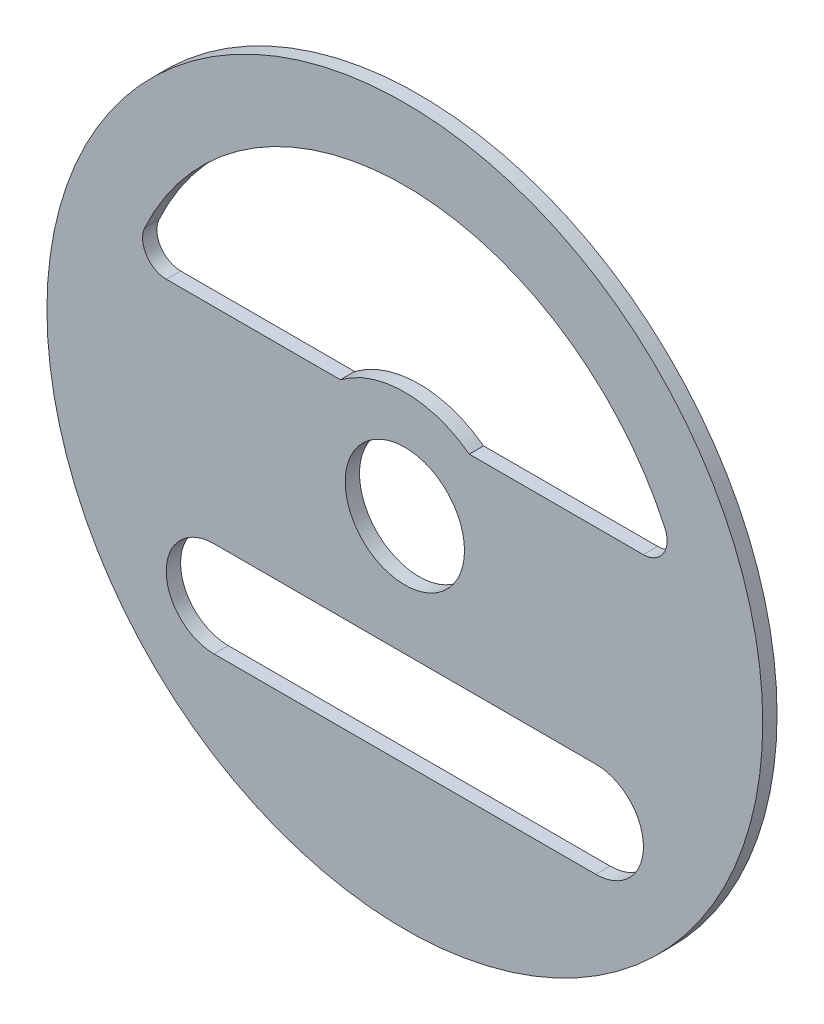
ISO-10303-21;
HEADER;
FILE_DESCRIPTION(('STEP AP214'),'2;1');
FILE_NAME('part.step','',(''),(''),'','','');
FILE_SCHEMA(('AUTOMOTIVE_DESIGN { 1 0 10303 214 1 1 1 1 }'));
ENDSEC;
DATA;
#1=APPLICATION_CONTEXT('core data for automotive mechanical design processes');
#2=APPLICATION_PROTOCOL_DEFINITION('international standard','automotive_design',2000,#1);
#3=PRODUCT_CONTEXT('',#1,'mechanical');
#4=PRODUCT('Part','Part','',(#3));
#5=PRODUCT_RELATED_PRODUCT_CATEGORY('part','',(#4));
#6=PRODUCT_DEFINITION_FORMATION('','',#4);
#7=PRODUCT_DEFINITION_CONTEXT('part definition',#1,'design');
#8=PRODUCT_DEFINITION('design','',#6,#7);
#9=PRODUCT_DEFINITION_SHAPE('','',#8);
#10=(LENGTH_UNIT() NAMED_UNIT(*) SI_UNIT(.MILLI.,.METRE.));
#11=(NAMED_UNIT(*) PLANE_ANGLE_UNIT() SI_UNIT($,.RADIAN.));
#12=(NAMED_UNIT(*) SI_UNIT($,.STERADIAN.) SOLID_ANGLE_UNIT());
#13=UNCERTAINTY_MEASURE_WITH_UNIT(LENGTH_MEASURE(1.E-05),#10,'distance_accuracy_value','');
#14=(GEOMETRIC_REPRESENTATION_CONTEXT(3) GLOBAL_UNCERTAINTY_ASSIGNED_CONTEXT((#13)) GLOBAL_UNIT_ASSIGNED_CONTEXT((#10,
#11,#12)) REPRESENTATION_CONTEXT('',''));
#15=CARTESIAN_POINT('',(0.,0.,0.));
#16=DIRECTION('',(0.,0.,1.));
#17=DIRECTION('',(1.,0.,0.));
#18=AXIS2_PLACEMENT_3D('',#15,#16,#17);
#19=CARTESIAN_POINT('',(0.,0.,3.));
#20=DIRECTION('',(0.,0.,1.));
#21=DIRECTION('',(1.,0.,0.));
#22=AXIS2_PLACEMENT_3D('',#19,#20,#21);
#23=PLANE('',#22);
#24=DIRECTION('',(1.,0.,0.));
#25=VECTOR('',#24,1.);
#26=CARTESIAN_POINT('',(-49.9599839871872,18.,3.));
#27=LINE('',#26,#25);
#28=CARTESIAN_POINT('',(-49.9599839871872,18.,3.));
#29=VERTEX_POINT('',#28);
#30=CARTESIAN_POINT('',(-13.5,18.,3.));
#31=VERTEX_POINT('',#30);
#32=EDGE_CURVE('E146',#29,#31,#27,.T.);
#33=ORIENTED_EDGE('',*,*,#32,.F.);
#34=CARTESIAN_POINT('',(-49.9599839871872,23.,3.));
#35=DIRECTION('',(0.,0.,1.));
#36=DIRECTION('',(-1.,0.,0.));
#37=AXIS2_PLACEMENT_3D('',#34,#35,#36);
#38=CIRCLE('',#37,4.99999999999999);
#39=CARTESIAN_POINT('',(-54.5018007132951,25.0909090909091,3.));
#40=VERTEX_POINT('',#39);
#41=EDGE_CURVE('E144',#40,#29,#38,.T.);
#42=ORIENTED_EDGE('',*,*,#41,.F.);
#43=CARTESIAN_POINT('',(0.,0.,3.));
#44=DIRECTION('',(0.,0.,1.));
#45=DIRECTION('',(1.,0.,0.));
#46=AXIS2_PLACEMENT_3D('',#43,#44,#45);
#47=CIRCLE('',#46,60.);
#48=CARTESIAN_POINT('',(54.5018007132951,25.0909090909091,3.));
#49=VERTEX_POINT('',#48);
#50=EDGE_CURVE('E156',#49,#40,#47,.T.);
#51=ORIENTED_EDGE('',*,*,#50,.F.);
#52=CARTESIAN_POINT('',(49.9599839871872,23.,3.));
#53=DIRECTION('',(0.,0.,1.));
#54=DIRECTION('',(1.,0.,0.));
#55=AXIS2_PLACEMENT_3D('',#52,#53,#54);
#56=CIRCLE('',#55,4.99999999999999);
#57=CARTESIAN_POINT('',(49.9599839871872,18.,3.));
#58=VERTEX_POINT('',#57);
#59=EDGE_CURVE('E153',#58,#49,#56,.T.);
#60=ORIENTED_EDGE('',*,*,#59,.F.);
#61=DIRECTION('',(1.,0.,0.));
#62=VECTOR('',#61,1.);
#63=CARTESIAN_POINT('',(13.5,18.,3.));
#64=LINE('',#63,#62);
#65=CARTESIAN_POINT('',(13.5,18.,3.));
#66=VERTEX_POINT('',#65);
#67=EDGE_CURVE('E151',#66,#58,#64,.T.);
#68=ORIENTED_EDGE('',*,*,#67,.F.);
#69=CARTESIAN_POINT('',(0.,0.,3.));
#70=DIRECTION('',(0.,0.,-1.));
#71=DIRECTION('',(1.,0.,0.));
#72=AXIS2_PLACEMENT_3D('',#69,#70,#71);
#73=CIRCLE('',#72,22.5);
#74=EDGE_CURVE('E149',#31,#66,#73,.T.);
#75=ORIENTED_EDGE('',*,*,#74,.F.);
#76=EDGE_LOOP('',(#33,#42,#51,#60,#68,#75));
#77=FACE_BOUND('',#76,.T.);
#78=CARTESIAN_POINT('',(0.,0.,3.));
#79=DIRECTION('',(0.,0.,1.));
#80=DIRECTION('',(1.,0.,0.));
#81=AXIS2_PLACEMENT_3D('',#78,#79,#80);
#82=CIRCLE('',#81,75.);
#83=CARTESIAN_POINT('',(75.,0.,3.));
#84=VERTEX_POINT('',#83);
#85=EDGE_CURVE('E11',#84,#84,#82,.T.);
#86=ORIENTED_EDGE('',*,*,#85,.T.);
#87=EDGE_LOOP('',(#86));
#88=FACE_BOUND('',#87,.T.);
#89=CARTESIAN_POINT('',(0.,0.,3.));
#90=DIRECTION('',(0.,0.,1.));
#91=DIRECTION('',(1.,0.,0.));
#92=AXIS2_PLACEMENT_3D('',#89,#90,#91);
#93=CIRCLE('',#92,12.5);
#94=CARTESIAN_POINT('',(12.5,0.,3.));
#95=VERTEX_POINT('',#94);
#96=EDGE_CURVE('E189',#95,#95,#93,.T.);
#97=ORIENTED_EDGE('',*,*,#96,.F.);
#98=EDGE_LOOP('',(#97));
#99=FACE_BOUND('',#98,.T.);
#100=DIRECTION('',(1.,0.,0.));
#101=VECTOR('',#100,1.);
#102=CARTESIAN_POINT('',(-40.,-45.,3.));
#103=LINE('',#102,#101);
#104=CARTESIAN_POINT('',(-40.,-45.,3.));
#105=VERTEX_POINT('',#104);
#106=CARTESIAN_POINT('',(40.,-45.,3.));
#107=VERTEX_POINT('',#106);
#108=EDGE_CURVE('E116',#105,#107,#103,.T.);
#109=ORIENTED_EDGE('',*,*,#108,.F.);
#110=CARTESIAN_POINT('',(-40.,-35.,3.));
#111=DIRECTION('',(0.,0.,1.));
#112=DIRECTION('',(1.,0.,0.));
#113=AXIS2_PLACEMENT_3D('',#110,#111,#112);
#114=CIRCLE('',#113,10.);
#115=CARTESIAN_POINT('',(-40.,-25.,3.));
#116=VERTEX_POINT('',#115);
#117=EDGE_CURVE('E108',#116,#105,#114,.T.);
#118=ORIENTED_EDGE('',*,*,#117,.F.);
#119=DIRECTION('',(-1.,0.,0.));
#120=VECTOR('',#119,1.);
#121=CARTESIAN_POINT('',(-40.,-25.,3.));
#122=LINE('',#121,#120);
#123=CARTESIAN_POINT('',(40.,-25.,3.));
#124=VERTEX_POINT('',#123);
#125=EDGE_CURVE('E130',#124,#116,#122,.T.);
#126=ORIENTED_EDGE('',*,*,#125,.F.);
#127=CARTESIAN_POINT('',(40.,-35.,3.));
#128=DIRECTION('',(0.,0.,1.));
#129=DIRECTION('',(1.,0.,0.));
#130=AXIS2_PLACEMENT_3D('',#127,#128,#129);
#131=CIRCLE('',#130,10.);
#132=EDGE_CURVE('E128',#107,#124,#131,.T.);
#133=ORIENTED_EDGE('',*,*,#132,.F.);
#134=EDGE_LOOP('',(#109,#118,#126,#133));
#135=FACE_BOUND('',#134,.T.);
#136=ADVANCED_FACE('F31',(#77,#88,#99,#135),#23,.T.);
#137=CARTESIAN_POINT('',(0.,0.,0.));
#138=DIRECTION('',(0.,0.,1.));
#139=DIRECTION('',(1.,0.,0.));
#140=AXIS2_PLACEMENT_3D('',#137,#138,#139);
#141=PLANE('',#140);
#142=CARTESIAN_POINT('',(-49.9599839871872,23.,0.));
#143=DIRECTION('',(0.,0.,1.));
#144=DIRECTION('',(-1.,0.,0.));
#145=AXIS2_PLACEMENT_3D('',#142,#143,#144);
#146=CIRCLE('',#145,4.99999999999999);
#147=CARTESIAN_POINT('',(-54.5018007132951,25.0909090909091,0.));
#148=VERTEX_POINT('',#147);
#149=CARTESIAN_POINT('',(-49.9599839871872,18.,0.));
#150=VERTEX_POINT('',#149);
#151=EDGE_CURVE('E124',#148,#150,#146,.T.);
#152=ORIENTED_EDGE('',*,*,#151,.T.);
#153=DIRECTION('',(1.,0.,0.));
#154=VECTOR('',#153,1.);
#155=CARTESIAN_POINT('',(-49.9599839871872,18.,0.));
#156=LINE('',#155,#154);
#157=CARTESIAN_POINT('',(-13.5,18.,0.));
#158=VERTEX_POINT('',#157);
#159=EDGE_CURVE('E161',#150,#158,#156,.T.);
#160=ORIENTED_EDGE('',*,*,#159,.T.);
#161=CARTESIAN_POINT('',(0.,0.,0.));
#162=DIRECTION('',(0.,0.,-1.));
#163=DIRECTION('',(1.,0.,0.));
#164=AXIS2_PLACEMENT_3D('',#161,#162,#163);
#165=CIRCLE('',#164,22.5);
#166=CARTESIAN_POINT('',(13.5,18.,0.));
#167=VERTEX_POINT('',#166);
#168=EDGE_CURVE('E164',#158,#167,#165,.T.);
#169=ORIENTED_EDGE('',*,*,#168,.T.);
#170=DIRECTION('',(1.,0.,0.));
#171=VECTOR('',#170,1.);
#172=CARTESIAN_POINT('',(13.5,18.,0.));
#173=LINE('',#172,#171);
#174=CARTESIAN_POINT('',(49.9599839871872,18.,0.));
#175=VERTEX_POINT('',#174);
#176=EDGE_CURVE('E167',#167,#175,#173,.T.);
#177=ORIENTED_EDGE('',*,*,#176,.T.);
#178=CARTESIAN_POINT('',(49.9599839871872,23.,0.));
#179=DIRECTION('',(0.,0.,1.));
#180=DIRECTION('',(1.,0.,0.));
#181=AXIS2_PLACEMENT_3D('',#178,#179,#180);
#182=CIRCLE('',#181,4.99999999999999);
#183=CARTESIAN_POINT('',(54.5018007132951,25.0909090909091,0.));
#184=VERTEX_POINT('',#183);
#185=EDGE_CURVE('E170',#175,#184,#182,.T.);
#186=ORIENTED_EDGE('',*,*,#185,.T.);
#187=CARTESIAN_POINT('',(0.,0.,0.));
#188=DIRECTION('',(0.,0.,1.));
#189=DIRECTION('',(1.,0.,0.));
#190=AXIS2_PLACEMENT_3D('',#187,#188,#189);
#191=CIRCLE('',#190,60.);
#192=EDGE_CURVE('E147',#184,#148,#191,.T.);
#193=ORIENTED_EDGE('',*,*,#192,.T.);
#194=EDGE_LOOP('',(#152,#160,#169,#177,#186,#193));
#195=FACE_BOUND('',#194,.T.);
#196=CARTESIAN_POINT('',(0.,0.,0.));
#197=DIRECTION('',(0.,0.,1.));
#198=DIRECTION('',(1.,0.,0.));
#199=AXIS2_PLACEMENT_3D('',#196,#197,#198);
#200=CIRCLE('',#199,75.);
#201=CARTESIAN_POINT('',(75.,0.,0.));
#202=VERTEX_POINT('',#201);
#203=EDGE_CURVE('E35',#202,#202,#200,.T.);
#204=ORIENTED_EDGE('',*,*,#203,.F.);
#205=EDGE_LOOP('',(#204));
#206=FACE_BOUND('',#205,.T.);
#207=CARTESIAN_POINT('',(0.,0.,0.));
#208=DIRECTION('',(0.,0.,1.));
#209=DIRECTION('',(1.,0.,0.));
#210=AXIS2_PLACEMENT_3D('',#207,#208,#209);
#211=CIRCLE('',#210,12.5);
#212=CARTESIAN_POINT('',(12.5,0.,0.));
#213=VERTEX_POINT('',#212);
#214=EDGE_CURVE('E188',#213,#213,#211,.T.);
#215=ORIENTED_EDGE('',*,*,#214,.T.);
#216=EDGE_LOOP('',(#215));
#217=FACE_BOUND('',#216,.T.);
#218=CARTESIAN_POINT('',(-40.,-35.,0.));
#219=DIRECTION('',(0.,0.,1.));
#220=DIRECTION('',(1.,0.,0.));
#221=AXIS2_PLACEMENT_3D('',#218,#219,#220);
#222=CIRCLE('',#221,10.);
#223=CARTESIAN_POINT('',(-40.,-25.,0.));
#224=VERTEX_POINT('',#223);
#225=CARTESIAN_POINT('',(-40.,-45.,0.));
#226=VERTEX_POINT('',#225);
#227=EDGE_CURVE('E54',#224,#226,#222,.T.);
#228=ORIENTED_EDGE('',*,*,#227,.T.);
#229=DIRECTION('',(1.,0.,0.));
#230=VECTOR('',#229,1.);
#231=CARTESIAN_POINT('',(-40.,-45.,0.));
#232=LINE('',#231,#230);
#233=CARTESIAN_POINT('',(40.,-45.,0.));
#234=VERTEX_POINT('',#233);
#235=EDGE_CURVE('E123',#226,#234,#232,.T.);
#236=ORIENTED_EDGE('',*,*,#235,.T.);
#237=CARTESIAN_POINT('',(40.,-35.,0.));
#238=DIRECTION('',(0.,0.,1.));
#239=DIRECTION('',(1.,0.,0.));
#240=AXIS2_PLACEMENT_3D('',#237,#238,#239);
#241=CIRCLE('',#240,10.);
#242=CARTESIAN_POINT('',(40.,-25.,0.));
#243=VERTEX_POINT('',#242);
#244=EDGE_CURVE('E136',#234,#243,#241,.T.);
#245=ORIENTED_EDGE('',*,*,#244,.T.);
#246=DIRECTION('',(-1.,0.,0.));
#247=VECTOR('',#246,1.);
#248=CARTESIAN_POINT('',(-40.,-25.,0.));
#249=LINE('',#248,#247);
#250=EDGE_CURVE('E117',#243,#224,#249,.T.);
#251=ORIENTED_EDGE('',*,*,#250,.T.);
#252=EDGE_LOOP('',(#228,#236,#245,#251));
#253=FACE_BOUND('',#252,.T.);
#254=ADVANCED_FACE('F195',(#195,#206,#217,#253),#141,.F.);
#255=CARTESIAN_POINT('',(0.,0.,3.));
#256=DIRECTION('',(0.,0.,-1.));
#257=DIRECTION('',(-1.,0.,0.));
#258=AXIS2_PLACEMENT_3D('',#255,#256,#257);
#259=CYLINDRICAL_SURFACE('',#258,75.);
#260=ORIENTED_EDGE('',*,*,#85,.F.);
#261=EDGE_LOOP('',(#260));
#262=FACE_BOUND('',#261,.T.);
#263=ORIENTED_EDGE('',*,*,#203,.T.);
#264=EDGE_LOOP('',(#263));
#265=FACE_BOUND('',#264,.T.);
#266=ADVANCED_FACE('F33',(#262,#265),#259,.T.);
#267=CARTESIAN_POINT('',(0.,0.,3.));
#268=DIRECTION('',(0.,0.,-1.));
#269=DIRECTION('',(-1.,0.,0.));
#270=AXIS2_PLACEMENT_3D('',#267,#268,#269);
#271=CYLINDRICAL_SURFACE('',#270,12.5);
#272=ORIENTED_EDGE('',*,*,#96,.T.);
#273=EDGE_LOOP('',(#272));
#274=FACE_BOUND('',#273,.T.);
#275=ORIENTED_EDGE('',*,*,#214,.F.);
#276=EDGE_LOOP('',(#275));
#277=FACE_BOUND('',#276,.T.);
#278=ADVANCED_FACE('F198',(#274,#277),#271,.F.);
#279=CARTESIAN_POINT('',(-49.9599839871872,23.,3.));
#280=DIRECTION('',(0.,0.,-1.));
#281=DIRECTION('',(-1.,0.,0.));
#282=AXIS2_PLACEMENT_3D('',#279,#280,#281);
#283=CYLINDRICAL_SURFACE('',#282,4.99999999999999);
#284=ORIENTED_EDGE('',*,*,#151,.F.);
#285=DIRECTION('',(0.,0.,-1.));
#286=VECTOR('',#285,1.);
#287=CARTESIAN_POINT('',(-54.5018007132951,25.0909090909091,3.));
#288=LINE('',#287,#286);
#289=EDGE_CURVE('E158',#40,#148,#288,.T.);
#290=ORIENTED_EDGE('',*,*,#289,.F.);
#291=ORIENTED_EDGE('',*,*,#41,.T.);
#292=DIRECTION('',(0.,0.,-1.));
#293=VECTOR('',#292,1.);
#294=CARTESIAN_POINT('',(-49.9599839871872,18.,3.));
#295=LINE('',#294,#293);
#296=EDGE_CURVE('E185',#29,#150,#295,.T.);
#297=ORIENTED_EDGE('',*,*,#296,.T.);
#298=EDGE_LOOP('',(#284,#290,#291,#297));
#299=FACE_BOUND('',#298,.T.);
#300=ADVANCED_FACE('F200',(#299),#283,.F.);
#301=CARTESIAN_POINT('',(-49.9599839871872,18.,3.));
#302=DIRECTION('',(0.,1.,0.));
#303=DIRECTION('',(-1.,0.,0.));
#304=AXIS2_PLACEMENT_3D('',#301,#302,#303);
#305=PLANE('',#304);
#306=ORIENTED_EDGE('',*,*,#159,.F.);
#307=ORIENTED_EDGE('',*,*,#296,.F.);
#308=ORIENTED_EDGE('',*,*,#32,.T.);
#309=DIRECTION('',(0.,0.,-1.));
#310=VECTOR('',#309,1.);
#311=CARTESIAN_POINT('',(-13.5,18.,3.));
#312=LINE('',#311,#310);
#313=EDGE_CURVE('E183',#31,#158,#312,.T.);
#314=ORIENTED_EDGE('',*,*,#313,.T.);
#315=EDGE_LOOP('',(#306,#307,#308,#314));
#316=FACE_BOUND('',#315,.T.);
#317=ADVANCED_FACE('F207',(#316),#305,.T.);
#318=CARTESIAN_POINT('',(0.,0.,3.));
#319=DIRECTION('',(0.,0.,-1.));
#320=DIRECTION('',(-1.,0.,0.));
#321=AXIS2_PLACEMENT_3D('',#318,#319,#320);
#322=CYLINDRICAL_SURFACE('',#321,22.5);
#323=ORIENTED_EDGE('',*,*,#168,.F.);
#324=ORIENTED_EDGE('',*,*,#313,.F.);
#325=ORIENTED_EDGE('',*,*,#74,.T.);
#326=DIRECTION('',(0.,0.,-1.));
#327=VECTOR('',#326,1.);
#328=CARTESIAN_POINT('',(13.5,18.,3.));
#329=LINE('',#328,#327);
#330=EDGE_CURVE('E181',#66,#167,#329,.T.);
#331=ORIENTED_EDGE('',*,*,#330,.T.);
#332=EDGE_LOOP('',(#323,#324,#325,#331));
#333=FACE_BOUND('',#332,.T.);
#334=ADVANCED_FACE('F236',(#333),#322,.T.);
#335=CARTESIAN_POINT('',(13.5,18.,3.));
#336=DIRECTION('',(0.,1.,0.));
#337=DIRECTION('',(-1.,0.,0.));
#338=AXIS2_PLACEMENT_3D('',#335,#336,#337);
#339=PLANE('',#338);
#340=ORIENTED_EDGE('',*,*,#176,.F.);
#341=ORIENTED_EDGE('',*,*,#330,.F.);
#342=ORIENTED_EDGE('',*,*,#67,.T.);
#343=DIRECTION('',(0.,0.,-1.));
#344=VECTOR('',#343,1.);
#345=CARTESIAN_POINT('',(49.9599839871872,18.,3.));
#346=LINE('',#345,#344);
#347=EDGE_CURVE('E179',#58,#175,#346,.T.);
#348=ORIENTED_EDGE('',*,*,#347,.T.);
#349=EDGE_LOOP('',(#340,#341,#342,#348));
#350=FACE_BOUND('',#349,.T.);
#351=ADVANCED_FACE('F249',(#350),#339,.T.);
#352=CARTESIAN_POINT('',(49.9599839871872,23.,3.));
#353=DIRECTION('',(0.,0.,-1.));
#354=DIRECTION('',(-1.,0.,0.));
#355=AXIS2_PLACEMENT_3D('',#352,#353,#354);
#356=CYLINDRICAL_SURFACE('',#355,4.99999999999999);
#357=ORIENTED_EDGE('',*,*,#185,.F.);
#358=ORIENTED_EDGE('',*,*,#347,.F.);
#359=ORIENTED_EDGE('',*,*,#59,.T.);
#360=DIRECTION('',(0.,0.,-1.));
#361=VECTOR('',#360,1.);
#362=CARTESIAN_POINT('',(54.5018007132951,25.0909090909091,3.));
#363=LINE('',#362,#361);
#364=EDGE_CURVE('E177',#49,#184,#363,.T.);
#365=ORIENTED_EDGE('',*,*,#364,.T.);
#366=EDGE_LOOP('',(#357,#358,#359,#365));
#367=FACE_BOUND('',#366,.T.);
#368=ADVANCED_FACE('F246',(#367),#356,.F.);
#369=CARTESIAN_POINT('',(0.,0.,3.));
#370=DIRECTION('',(0.,0.,-1.));
#371=DIRECTION('',(-1.,0.,0.));
#372=AXIS2_PLACEMENT_3D('',#369,#370,#371);
#373=CYLINDRICAL_SURFACE('',#372,60.);
#374=ORIENTED_EDGE('',*,*,#192,.F.);
#375=ORIENTED_EDGE('',*,*,#364,.F.);
#376=ORIENTED_EDGE('',*,*,#50,.T.);
#377=ORIENTED_EDGE('',*,*,#289,.T.);
#378=EDGE_LOOP('',(#374,#375,#376,#377));
#379=FACE_BOUND('',#378,.T.);
#380=ADVANCED_FACE('F242',(#379),#373,.F.);
#381=CARTESIAN_POINT('',(-40.,-35.,3.));
#382=DIRECTION('',(0.,0.,-1.));
#383=DIRECTION('',(-1.,0.,0.));
#384=AXIS2_PLACEMENT_3D('',#381,#382,#383);
#385=CYLINDRICAL_SURFACE('',#384,10.);
#386=ORIENTED_EDGE('',*,*,#227,.F.);
#387=DIRECTION('',(0.,0.,-1.));
#388=VECTOR('',#387,1.);
#389=CARTESIAN_POINT('',(-40.,-25.,3.));
#390=LINE('',#389,#388);
#391=EDGE_CURVE('E112',#116,#224,#390,.T.);
#392=ORIENTED_EDGE('',*,*,#391,.F.);
#393=ORIENTED_EDGE('',*,*,#117,.T.);
#394=DIRECTION('',(0.,0.,-1.));
#395=VECTOR('',#394,1.);
#396=CARTESIAN_POINT('',(-40.,-45.,3.));
#397=LINE('',#396,#395);
#398=EDGE_CURVE('E111',#105,#226,#397,.T.);
#399=ORIENTED_EDGE('',*,*,#398,.T.);
#400=EDGE_LOOP('',(#386,#392,#393,#399));
#401=FACE_BOUND('',#400,.T.);
#402=ADVANCED_FACE('F110',(#401),#385,.F.);
#403=CARTESIAN_POINT('',(-40.,-45.,3.));
#404=DIRECTION('',(0.,1.,0.));
#405=DIRECTION('',(-1.,0.,0.));
#406=AXIS2_PLACEMENT_3D('',#403,#404,#405);
#407=PLANE('',#406);
#408=ORIENTED_EDGE('',*,*,#235,.F.);
#409=ORIENTED_EDGE('',*,*,#398,.F.);
#410=ORIENTED_EDGE('',*,*,#108,.T.);
#411=DIRECTION('',(0.,0.,-1.));
#412=VECTOR('',#411,1.);
#413=CARTESIAN_POINT('',(40.,-45.,3.));
#414=LINE('',#413,#412);
#415=EDGE_CURVE('E125',#107,#234,#414,.T.);
#416=ORIENTED_EDGE('',*,*,#415,.T.);
#417=EDGE_LOOP('',(#408,#409,#410,#416));
#418=FACE_BOUND('',#417,.T.);
#419=ADVANCED_FACE('F120',(#418),#407,.T.);
#420=CARTESIAN_POINT('',(40.,-35.,3.));
#421=DIRECTION('',(0.,0.,-1.));
#422=DIRECTION('',(-1.,0.,0.));
#423=AXIS2_PLACEMENT_3D('',#420,#421,#422);
#424=CYLINDRICAL_SURFACE('',#423,10.);
#425=ORIENTED_EDGE('',*,*,#244,.F.);
#426=ORIENTED_EDGE('',*,*,#415,.F.);
#427=ORIENTED_EDGE('',*,*,#132,.T.);
#428=DIRECTION('',(0.,0.,-1.));
#429=VECTOR('',#428,1.);
#430=CARTESIAN_POINT('',(40.,-25.,3.));
#431=LINE('',#430,#429);
#432=EDGE_CURVE('E46',#124,#243,#431,.T.);
#433=ORIENTED_EDGE('',*,*,#432,.T.);
#434=EDGE_LOOP('',(#425,#426,#427,#433));
#435=FACE_BOUND('',#434,.T.);
#436=ADVANCED_FACE('F303',(#435),#424,.F.);
#437=CARTESIAN_POINT('',(-40.,-25.,3.));
#438=DIRECTION('',(0.,-1.,0.));
#439=DIRECTION('',(1.,0.,0.));
#440=AXIS2_PLACEMENT_3D('',#437,#438,#439);
#441=PLANE('',#440);
#442=ORIENTED_EDGE('',*,*,#250,.F.);
#443=ORIENTED_EDGE('',*,*,#432,.F.);
#444=ORIENTED_EDGE('',*,*,#125,.T.);
#445=ORIENTED_EDGE('',*,*,#391,.T.);
#446=EDGE_LOOP('',(#442,#443,#444,#445));
#447=FACE_BOUND('',#446,.T.);
#448=ADVANCED_FACE('F312',(#447),#441,.T.);
#449=CLOSED_SHELL('',(#136,#254,#266,#278,#300,#317,#334,#351,#368,#380,#402,#419,#436,#448));
#450=MANIFOLD_SOLID_BREP('B2',#449);
#451=ADVANCED_BREP_SHAPE_REPRESENTATION('',(#18,#450),#14);
#452=SHAPE_DEFINITION_REPRESENTATION(#9,#451);
ENDSEC;
END-ISO-10303-21;
